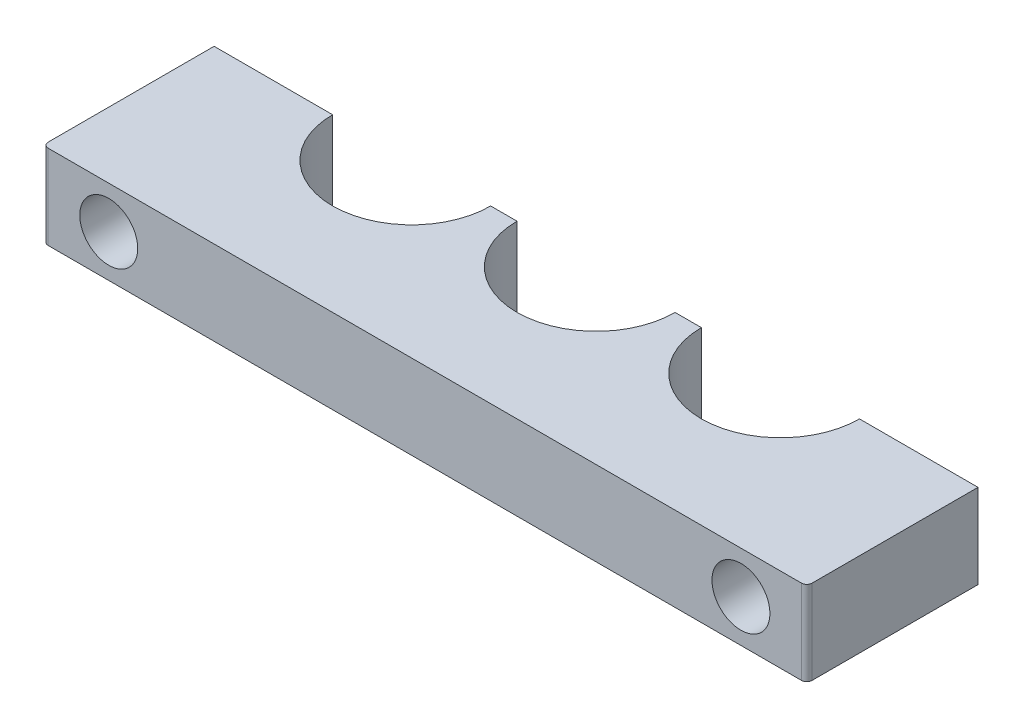
ISO-10303-21;
HEADER;
FILE_DESCRIPTION(('STEP AP214'),'2;1');
FILE_NAME('part.step','',(''),(''),'','','');
FILE_SCHEMA(('AUTOMOTIVE_DESIGN { 1 0 10303 214 1 1 1 1 }'));
ENDSEC;
DATA;
#1=APPLICATION_CONTEXT('core data for automotive mechanical design processes');
#2=APPLICATION_PROTOCOL_DEFINITION('international standard','automotive_design',2000,#1);
#3=PRODUCT_CONTEXT('',#1,'mechanical');
#4=PRODUCT('Part','Part','',(#3));
#5=PRODUCT_RELATED_PRODUCT_CATEGORY('part','',(#4));
#6=PRODUCT_DEFINITION_FORMATION('','',#4);
#7=PRODUCT_DEFINITION_CONTEXT('part definition',#1,'design');
#8=PRODUCT_DEFINITION('design','',#6,#7);
#9=PRODUCT_DEFINITION_SHAPE('','',#8);
#10=(LENGTH_UNIT() NAMED_UNIT(*) SI_UNIT(.MILLI.,.METRE.));
#11=(NAMED_UNIT(*) PLANE_ANGLE_UNIT() SI_UNIT($,.RADIAN.));
#12=(NAMED_UNIT(*) SI_UNIT($,.STERADIAN.) SOLID_ANGLE_UNIT());
#13=UNCERTAINTY_MEASURE_WITH_UNIT(LENGTH_MEASURE(1.E-05),#10,'distance_accuracy_value','');
#14=(GEOMETRIC_REPRESENTATION_CONTEXT(3) GLOBAL_UNCERTAINTY_ASSIGNED_CONTEXT((#13)) GLOBAL_UNIT_ASSIGNED_CONTEXT((#10,
#11,#12)) REPRESENTATION_CONTEXT('',''));
#15=CARTESIAN_POINT('',(0.,0.,0.));
#16=DIRECTION('',(0.,0.,1.));
#17=DIRECTION('',(1.,0.,0.));
#18=AXIS2_PLACEMENT_3D('',#15,#16,#17);
#19=CARTESIAN_POINT('',(71.5,16.,15.25));
#20=DIRECTION('',(0.,-1.,0.));
#21=DIRECTION('',(0.,0.,-1.));
#22=AXIS2_PLACEMENT_3D('',#19,#20,#21);
#23=CYLINDRICAL_SURFACE('',#22,1.);
#24=CARTESIAN_POINT('',(71.5,16.,15.25));
#25=DIRECTION('',(0.,1.,0.));
#26=DIRECTION('',(0.,0.,-1.));
#27=AXIS2_PLACEMENT_3D('',#24,#25,#26);
#28=CIRCLE('',#27,1.);
#29=CARTESIAN_POINT('',(71.5,16.,16.25));
#30=VERTEX_POINT('',#29);
#31=CARTESIAN_POINT('',(72.5,16.,15.25));
#32=VERTEX_POINT('',#31);
#33=EDGE_CURVE('E172',#30,#32,#28,.T.);
#34=ORIENTED_EDGE('',*,*,#33,.F.);
#35=DIRECTION('',(0.,1.,0.));
#36=VECTOR('',#35,1.);
#37=CARTESIAN_POINT('',(71.5,16.,16.25));
#38=LINE('',#37,#36);
#39=CARTESIAN_POINT('',(71.5,0.,16.25));
#40=VERTEX_POINT('',#39);
#41=EDGE_CURVE('E135',#40,#30,#38,.T.);
#42=ORIENTED_EDGE('',*,*,#41,.F.);
#43=CARTESIAN_POINT('',(71.5,0.,15.25));
#44=DIRECTION('',(0.,-1.,0.));
#45=DIRECTION('',(0.,0.,-1.));
#46=AXIS2_PLACEMENT_3D('',#43,#44,#45);
#47=CIRCLE('',#46,1.);
#48=CARTESIAN_POINT('',(72.5,0.,15.25));
#49=VERTEX_POINT('',#48);
#50=EDGE_CURVE('E25',#49,#40,#47,.T.);
#51=ORIENTED_EDGE('',*,*,#50,.F.);
#52=DIRECTION('',(0.,-1.,0.));
#53=VECTOR('',#52,1.);
#54=CARTESIAN_POINT('',(72.5,16.,15.25));
#55=LINE('',#54,#53);
#56=EDGE_CURVE('E132',#32,#49,#55,.T.);
#57=ORIENTED_EDGE('',*,*,#56,.F.);
#58=EDGE_LOOP('',(#34,#42,#51,#57));
#59=FACE_BOUND('',#58,.T.);
#60=ADVANCED_FACE('F15',(#59),#23,.T.);
#61=CARTESIAN_POINT('',(-71.5,16.,15.25));
#62=DIRECTION('',(0.,-1.,0.));
#63=DIRECTION('',(0.,0.,-1.));
#64=AXIS2_PLACEMENT_3D('',#61,#62,#63);
#65=CYLINDRICAL_SURFACE('',#64,1.);
#66=CARTESIAN_POINT('',(-71.5,16.,15.25));
#67=DIRECTION('',(0.,1.,0.));
#68=DIRECTION('',(0.,0.,-1.));
#69=AXIS2_PLACEMENT_3D('',#66,#67,#68);
#70=CIRCLE('',#69,1.);
#71=CARTESIAN_POINT('',(-72.5,16.,15.25));
#72=VERTEX_POINT('',#71);
#73=CARTESIAN_POINT('',(-71.5,16.,16.25));
#74=VERTEX_POINT('',#73);
#75=EDGE_CURVE('E140',#72,#74,#70,.T.);
#76=ORIENTED_EDGE('',*,*,#75,.F.);
#77=DIRECTION('',(0.,1.,0.));
#78=VECTOR('',#77,1.);
#79=CARTESIAN_POINT('',(-72.5,16.,15.25));
#80=LINE('',#79,#78);
#81=CARTESIAN_POINT('',(-72.5,0.,15.25));
#82=VERTEX_POINT('',#81);
#83=EDGE_CURVE('E257',#82,#72,#80,.T.);
#84=ORIENTED_EDGE('',*,*,#83,.F.);
#85=CARTESIAN_POINT('',(-71.5,0.,15.25));
#86=DIRECTION('',(0.,-1.,0.));
#87=DIRECTION('',(0.,0.,-1.));
#88=AXIS2_PLACEMENT_3D('',#85,#86,#87);
#89=CIRCLE('',#88,1.);
#90=CARTESIAN_POINT('',(-71.5,0.,16.25));
#91=VERTEX_POINT('',#90);
#92=EDGE_CURVE('E10',#91,#82,#89,.T.);
#93=ORIENTED_EDGE('',*,*,#92,.F.);
#94=DIRECTION('',(0.,-1.,0.));
#95=VECTOR('',#94,1.);
#96=CARTESIAN_POINT('',(-71.5,16.,16.25));
#97=LINE('',#96,#95);
#98=EDGE_CURVE('E160',#74,#91,#97,.T.);
#99=ORIENTED_EDGE('',*,*,#98,.F.);
#100=EDGE_LOOP('',(#76,#84,#93,#99));
#101=FACE_BOUND('',#100,.T.);
#102=ADVANCED_FACE('F17',(#101),#65,.T.);
#103=CARTESIAN_POINT('',(-60.,8.,-33.2314230340251));
#104=DIRECTION('',(0.,0.,1.));
#105=DIRECTION('',(1.,0.,0.));
#106=AXIS2_PLACEMENT_3D('',#103,#104,#105);
#107=CYLINDRICAL_SURFACE('',#106,5.5);
#108=CARTESIAN_POINT('',(-60.,8.,-16.25));
#109=DIRECTION('',(0.,0.,-1.));
#110=DIRECTION('',(1.,0.,0.));
#111=AXIS2_PLACEMENT_3D('',#108,#109,#110);
#112=CIRCLE('',#111,5.5);
#113=CARTESIAN_POINT('',(-54.5,8.,-16.25));
#114=VERTEX_POINT('',#113);
#115=EDGE_CURVE('E198',#114,#114,#112,.T.);
#116=ORIENTED_EDGE('',*,*,#115,.T.);
#117=EDGE_LOOP('',(#116));
#118=FACE_BOUND('',#117,.T.);
#119=CARTESIAN_POINT('',(-60.,8.,16.25));
#120=DIRECTION('',(0.,0.,-1.));
#121=DIRECTION('',(1.,0.,0.));
#122=AXIS2_PLACEMENT_3D('',#119,#120,#121);
#123=CIRCLE('',#122,5.5);
#124=CARTESIAN_POINT('',(-54.5,8.,16.25));
#125=VERTEX_POINT('',#124);
#126=EDGE_CURVE('E268',#125,#125,#123,.T.);
#127=ORIENTED_EDGE('',*,*,#126,.F.);
#128=EDGE_LOOP('',(#127));
#129=FACE_BOUND('',#128,.T.);
#130=ADVANCED_FACE('F360',(#118,#129),#107,.F.);
#131=CARTESIAN_POINT('',(60.,8.,-33.2314230340251));
#132=DIRECTION('',(0.,0.,1.));
#133=DIRECTION('',(1.,0.,0.));
#134=AXIS2_PLACEMENT_3D('',#131,#132,#133);
#135=CYLINDRICAL_SURFACE('',#134,5.5);
#136=CARTESIAN_POINT('',(60.,8.,-16.25));
#137=DIRECTION('',(0.,0.,-1.));
#138=DIRECTION('',(1.,0.,0.));
#139=AXIS2_PLACEMENT_3D('',#136,#137,#138);
#140=CIRCLE('',#139,5.5);
#141=CARTESIAN_POINT('',(65.5,8.,-16.25));
#142=VERTEX_POINT('',#141);
#143=EDGE_CURVE('E36',#142,#142,#140,.T.);
#144=ORIENTED_EDGE('',*,*,#143,.T.);
#145=EDGE_LOOP('',(#144));
#146=FACE_BOUND('',#145,.T.);
#147=CARTESIAN_POINT('',(60.,8.,16.25));
#148=DIRECTION('',(0.,0.,-1.));
#149=DIRECTION('',(1.,0.,0.));
#150=AXIS2_PLACEMENT_3D('',#147,#148,#149);
#151=CIRCLE('',#150,5.5);
#152=CARTESIAN_POINT('',(65.5,8.,16.25));
#153=VERTEX_POINT('',#152);
#154=EDGE_CURVE('E269',#153,#153,#151,.T.);
#155=ORIENTED_EDGE('',*,*,#154,.F.);
#156=EDGE_LOOP('',(#155));
#157=FACE_BOUND('',#156,.T.);
#158=ADVANCED_FACE('F364',(#146,#157),#135,.F.);
#159=CARTESIAN_POINT('',(35.,0.,-16.25));
#160=DIRECTION('',(0.,-1.,0.));
#161=DIRECTION('',(0.,0.,-1.));
#162=AXIS2_PLACEMENT_3D('',#159,#160,#161);
#163=PLANE('',#162);
#164=DIRECTION('',(0.,0.,-1.));
#165=VECTOR('',#164,1.);
#166=CARTESIAN_POINT('',(72.5,0.,16.25));
#167=LINE('',#166,#165);
#168=CARTESIAN_POINT('',(72.5,0.,-16.25));
#169=VERTEX_POINT('',#168);
#170=EDGE_CURVE('E142',#49,#169,#167,.T.);
#171=ORIENTED_EDGE('',*,*,#170,.F.);
#172=ORIENTED_EDGE('',*,*,#50,.T.);
#173=DIRECTION('',(1.,0.,0.));
#174=VECTOR('',#173,1.);
#175=CARTESIAN_POINT('',(35.,0.,16.25));
#176=LINE('',#175,#174);
#177=EDGE_CURVE('E272',#91,#40,#176,.T.);
#178=ORIENTED_EDGE('',*,*,#177,.F.);
#179=ORIENTED_EDGE('',*,*,#92,.T.);
#180=DIRECTION('',(0.,0.,1.));
#181=VECTOR('',#180,1.);
#182=CARTESIAN_POINT('',(-72.5,0.,-16.25));
#183=LINE('',#182,#181);
#184=CARTESIAN_POINT('',(-72.5,0.,-16.25));
#185=VERTEX_POINT('',#184);
#186=EDGE_CURVE('E253',#185,#82,#183,.T.);
#187=ORIENTED_EDGE('',*,*,#186,.F.);
#188=DIRECTION('',(-1.,0.,0.));
#189=VECTOR('',#188,1.);
#190=CARTESIAN_POINT('',(-50.,0.,-16.25));
#191=LINE('',#190,#189);
#192=CARTESIAN_POINT('',(-50.,0.,-16.25));
#193=VERTEX_POINT('',#192);
#194=EDGE_CURVE('E193',#193,#185,#191,.T.);
#195=ORIENTED_EDGE('',*,*,#194,.F.);
#196=CARTESIAN_POINT('',(-35.,0.,-16.25));
#197=DIRECTION('',(0.,-1.,0.));
#198=DIRECTION('',(1.,0.,0.));
#199=AXIS2_PLACEMENT_3D('',#196,#197,#198);
#200=CIRCLE('',#199,15.);
#201=CARTESIAN_POINT('',(-20.,0.,-16.25));
#202=VERTEX_POINT('',#201);
#203=EDGE_CURVE('E215',#202,#193,#200,.T.);
#204=ORIENTED_EDGE('',*,*,#203,.F.);
#205=DIRECTION('',(-1.,0.,0.));
#206=VECTOR('',#205,1.);
#207=CARTESIAN_POINT('',(-15.,0.,-16.25));
#208=LINE('',#207,#206);
#209=CARTESIAN_POINT('',(-15.,0.,-16.25));
#210=VERTEX_POINT('',#209);
#211=EDGE_CURVE('E224',#210,#202,#208,.T.);
#212=ORIENTED_EDGE('',*,*,#211,.F.);
#213=CARTESIAN_POINT('',(0.,0.,-16.25));
#214=DIRECTION('',(0.,-1.,0.));
#215=DIRECTION('',(1.,0.,0.));
#216=AXIS2_PLACEMENT_3D('',#213,#214,#215);
#217=CIRCLE('',#216,15.);
#218=CARTESIAN_POINT('',(15.,0.,-16.25));
#219=VERTEX_POINT('',#218);
#220=EDGE_CURVE('E220',#219,#210,#217,.T.);
#221=ORIENTED_EDGE('',*,*,#220,.F.);
#222=DIRECTION('',(-1.,0.,0.));
#223=VECTOR('',#222,1.);
#224=CARTESIAN_POINT('',(20.,0.,-16.25));
#225=LINE('',#224,#223);
#226=CARTESIAN_POINT('',(20.,0.,-16.25));
#227=VERTEX_POINT('',#226);
#228=EDGE_CURVE('E202',#227,#219,#225,.T.);
#229=ORIENTED_EDGE('',*,*,#228,.F.);
#230=CARTESIAN_POINT('',(35.,0.,-16.25));
#231=DIRECTION('',(0.,-1.,0.));
#232=DIRECTION('',(1.,0.,0.));
#233=AXIS2_PLACEMENT_3D('',#230,#231,#232);
#234=CIRCLE('',#233,15.);
#235=CARTESIAN_POINT('',(50.,0.,-16.25));
#236=VERTEX_POINT('',#235);
#237=EDGE_CURVE('E328',#236,#227,#234,.T.);
#238=ORIENTED_EDGE('',*,*,#237,.F.);
#239=DIRECTION('',(-1.,0.,0.));
#240=VECTOR('',#239,1.);
#241=CARTESIAN_POINT('',(72.5,0.,-16.25));
#242=LINE('',#241,#240);
#243=EDGE_CURVE('E146',#169,#236,#242,.T.);
#244=ORIENTED_EDGE('',*,*,#243,.F.);
#245=EDGE_LOOP('',(#171,#172,#178,#179,#187,#195,#204,#212,#221,#229,#238,#244));
#246=FACE_BOUND('',#245,.T.);
#247=ADVANCED_FACE('F143',(#246),#163,.T.);
#248=CARTESIAN_POINT('',(35.,16.,-16.25));
#249=DIRECTION('',(0.,-1.,0.));
#250=DIRECTION('',(0.,0.,-1.));
#251=AXIS2_PLACEMENT_3D('',#248,#249,#250);
#252=PLANE('',#251);
#253=DIRECTION('',(1.,0.,0.));
#254=VECTOR('',#253,1.);
#255=CARTESIAN_POINT('',(-72.5,16.,16.25));
#256=LINE('',#255,#254);
#257=EDGE_CURVE('E261',#74,#30,#256,.T.);
#258=ORIENTED_EDGE('',*,*,#257,.T.);
#259=ORIENTED_EDGE('',*,*,#33,.T.);
#260=DIRECTION('',(0.,0.,-1.));
#261=VECTOR('',#260,1.);
#262=CARTESIAN_POINT('',(72.5,16.,16.25));
#263=LINE('',#262,#261);
#264=CARTESIAN_POINT('',(72.5,16.,-16.25));
#265=VERTEX_POINT('',#264);
#266=EDGE_CURVE('E153',#32,#265,#263,.T.);
#267=ORIENTED_EDGE('',*,*,#266,.T.);
#268=DIRECTION('',(-1.,0.,0.));
#269=VECTOR('',#268,1.);
#270=CARTESIAN_POINT('',(72.5,16.,-16.25));
#271=LINE('',#270,#269);
#272=CARTESIAN_POINT('',(50.,16.,-16.25));
#273=VERTEX_POINT('',#272);
#274=EDGE_CURVE('E122',#265,#273,#271,.T.);
#275=ORIENTED_EDGE('',*,*,#274,.T.);
#276=CARTESIAN_POINT('',(35.,16.,-16.25));
#277=DIRECTION('',(0.,-1.,0.));
#278=DIRECTION('',(1.,0.,0.));
#279=AXIS2_PLACEMENT_3D('',#276,#277,#278);
#280=CIRCLE('',#279,15.);
#281=CARTESIAN_POINT('',(20.,16.,-16.25));
#282=VERTEX_POINT('',#281);
#283=EDGE_CURVE('E188',#273,#282,#280,.T.);
#284=ORIENTED_EDGE('',*,*,#283,.T.);
#285=DIRECTION('',(-1.,0.,0.));
#286=VECTOR('',#285,1.);
#287=CARTESIAN_POINT('',(20.,16.,-16.25));
#288=LINE('',#287,#286);
#289=CARTESIAN_POINT('',(15.,16.,-16.25));
#290=VERTEX_POINT('',#289);
#291=EDGE_CURVE('E210',#282,#290,#288,.T.);
#292=ORIENTED_EDGE('',*,*,#291,.T.);
#293=CARTESIAN_POINT('',(0.,16.,-16.25));
#294=DIRECTION('',(0.,-1.,0.));
#295=DIRECTION('',(1.,0.,0.));
#296=AXIS2_PLACEMENT_3D('',#293,#294,#295);
#297=CIRCLE('',#296,15.);
#298=CARTESIAN_POINT('',(-15.,16.,-16.25));
#299=VERTEX_POINT('',#298);
#300=EDGE_CURVE('E229',#290,#299,#297,.T.);
#301=ORIENTED_EDGE('',*,*,#300,.T.);
#302=DIRECTION('',(-1.,0.,0.));
#303=VECTOR('',#302,1.);
#304=CARTESIAN_POINT('',(-15.,16.,-16.25));
#305=LINE('',#304,#303);
#306=CARTESIAN_POINT('',(-20.,16.,-16.25));
#307=VERTEX_POINT('',#306);
#308=EDGE_CURVE('E211',#299,#307,#305,.T.);
#309=ORIENTED_EDGE('',*,*,#308,.T.);
#310=CARTESIAN_POINT('',(-35.,16.,-16.25));
#311=DIRECTION('',(0.,-1.,0.));
#312=DIRECTION('',(1.,0.,0.));
#313=AXIS2_PLACEMENT_3D('',#310,#311,#312);
#314=CIRCLE('',#313,15.);
#315=CARTESIAN_POINT('',(-50.,16.,-16.25));
#316=VERTEX_POINT('',#315);
#317=EDGE_CURVE('E233',#307,#316,#314,.T.);
#318=ORIENTED_EDGE('',*,*,#317,.T.);
#319=DIRECTION('',(-1.,0.,0.));
#320=VECTOR('',#319,1.);
#321=CARTESIAN_POINT('',(-50.,16.,-16.25));
#322=LINE('',#321,#320);
#323=CARTESIAN_POINT('',(-72.5,16.,-16.25));
#324=VERTEX_POINT('',#323);
#325=EDGE_CURVE('E249',#316,#324,#322,.T.);
#326=ORIENTED_EDGE('',*,*,#325,.T.);
#327=DIRECTION('',(0.,0.,1.));
#328=VECTOR('',#327,1.);
#329=CARTESIAN_POINT('',(-72.5,16.,-16.25));
#330=LINE('',#329,#328);
#331=EDGE_CURVE('E265',#324,#72,#330,.T.);
#332=ORIENTED_EDGE('',*,*,#331,.T.);
#333=ORIENTED_EDGE('',*,*,#75,.T.);
#334=EDGE_LOOP('',(#258,#259,#267,#275,#284,#292,#301,#309,#318,#326,#332,#333));
#335=FACE_BOUND('',#334,.T.);
#336=ADVANCED_FACE('F280',(#335),#252,.F.);
#337=CARTESIAN_POINT('',(72.5,16.,-16.25));
#338=DIRECTION('',(0.,0.,1.));
#339=DIRECTION('',(1.,0.,0.));
#340=AXIS2_PLACEMENT_3D('',#337,#338,#339);
#341=PLANE('',#340);
#342=ORIENTED_EDGE('',*,*,#243,.T.);
#343=DIRECTION('',(0.,-1.,0.));
#344=VECTOR('',#343,1.);
#345=CARTESIAN_POINT('',(50.,16.,-16.25));
#346=LINE('',#345,#344);
#347=EDGE_CURVE('E192',#273,#236,#346,.T.);
#348=ORIENTED_EDGE('',*,*,#347,.F.);
#349=ORIENTED_EDGE('',*,*,#274,.F.);
#350=DIRECTION('',(0.,-1.,0.));
#351=VECTOR('',#350,1.);
#352=CARTESIAN_POINT('',(72.5,16.,-16.25));
#353=LINE('',#352,#351);
#354=EDGE_CURVE('E149',#265,#169,#353,.T.);
#355=ORIENTED_EDGE('',*,*,#354,.T.);
#356=EDGE_LOOP('',(#342,#348,#349,#355));
#357=FACE_BOUND('',#356,.T.);
#358=ORIENTED_EDGE('',*,*,#143,.F.);
#359=EDGE_LOOP('',(#358));
#360=FACE_BOUND('',#359,.T.);
#361=ADVANCED_FACE('F343',(#357,#360),#341,.F.);
#362=CARTESIAN_POINT('',(72.5,16.,16.25));
#363=DIRECTION('',(-1.,0.,0.));
#364=DIRECTION('',(0.,0.,1.));
#365=AXIS2_PLACEMENT_3D('',#362,#363,#364);
#366=PLANE('',#365);
#367=ORIENTED_EDGE('',*,*,#266,.F.);
#368=ORIENTED_EDGE('',*,*,#56,.T.);
#369=ORIENTED_EDGE('',*,*,#170,.T.);
#370=ORIENTED_EDGE('',*,*,#354,.F.);
#371=EDGE_LOOP('',(#367,#368,#369,#370));
#372=FACE_BOUND('',#371,.T.);
#373=ADVANCED_FACE('F151',(#372),#366,.F.);
#374=CARTESIAN_POINT('',(35.,16.,16.25));
#375=DIRECTION('',(0.,0.,-1.));
#376=DIRECTION('',(0.,-1.,0.));
#377=AXIS2_PLACEMENT_3D('',#374,#375,#376);
#378=PLANE('',#377);
#379=ORIENTED_EDGE('',*,*,#177,.T.);
#380=ORIENTED_EDGE('',*,*,#41,.T.);
#381=ORIENTED_EDGE('',*,*,#257,.F.);
#382=ORIENTED_EDGE('',*,*,#98,.T.);
#383=EDGE_LOOP('',(#379,#380,#381,#382));
#384=FACE_BOUND('',#383,.T.);
#385=ORIENTED_EDGE('',*,*,#154,.T.);
#386=EDGE_LOOP('',(#385));
#387=FACE_BOUND('',#386,.T.);
#388=ORIENTED_EDGE('',*,*,#126,.T.);
#389=EDGE_LOOP('',(#388));
#390=FACE_BOUND('',#389,.T.);
#391=ADVANCED_FACE('F282',(#384,#387,#390),#378,.F.);
#392=CARTESIAN_POINT('',(-72.5,16.,-16.25));
#393=DIRECTION('',(1.,0.,0.));
#394=DIRECTION('',(0.,1.,0.));
#395=AXIS2_PLACEMENT_3D('',#392,#393,#394);
#396=PLANE('',#395);
#397=ORIENTED_EDGE('',*,*,#186,.T.);
#398=ORIENTED_EDGE('',*,*,#83,.T.);
#399=ORIENTED_EDGE('',*,*,#331,.F.);
#400=DIRECTION('',(0.,-1.,0.));
#401=VECTOR('',#400,1.);
#402=CARTESIAN_POINT('',(-72.5,16.,-16.25));
#403=LINE('',#402,#401);
#404=EDGE_CURVE('E197',#324,#185,#403,.T.);
#405=ORIENTED_EDGE('',*,*,#404,.T.);
#406=EDGE_LOOP('',(#397,#398,#399,#405));
#407=FACE_BOUND('',#406,.T.);
#408=ADVANCED_FACE('F289',(#407),#396,.F.);
#409=CARTESIAN_POINT('',(-50.,16.,-16.25));
#410=DIRECTION('',(0.,0.,1.));
#411=DIRECTION('',(1.,0.,0.));
#412=AXIS2_PLACEMENT_3D('',#409,#410,#411);
#413=PLANE('',#412);
#414=ORIENTED_EDGE('',*,*,#194,.T.);
#415=ORIENTED_EDGE('',*,*,#404,.F.);
#416=ORIENTED_EDGE('',*,*,#325,.F.);
#417=DIRECTION('',(0.,-1.,0.));
#418=VECTOR('',#417,1.);
#419=CARTESIAN_POINT('',(-50.,16.,-16.25));
#420=LINE('',#419,#418);
#421=EDGE_CURVE('E237',#316,#193,#420,.T.);
#422=ORIENTED_EDGE('',*,*,#421,.T.);
#423=EDGE_LOOP('',(#414,#415,#416,#422));
#424=FACE_BOUND('',#423,.T.);
#425=ORIENTED_EDGE('',*,*,#115,.F.);
#426=EDGE_LOOP('',(#425));
#427=FACE_BOUND('',#426,.T.);
#428=ADVANCED_FACE('F294',(#424,#427),#413,.F.);
#429=CARTESIAN_POINT('',(-35.,16.,-16.25));
#430=DIRECTION('',(0.,-1.,0.));
#431=DIRECTION('',(0.,0.,-1.));
#432=AXIS2_PLACEMENT_3D('',#429,#430,#431);
#433=CYLINDRICAL_SURFACE('',#432,15.);
#434=ORIENTED_EDGE('',*,*,#203,.T.);
#435=ORIENTED_EDGE('',*,*,#421,.F.);
#436=ORIENTED_EDGE('',*,*,#317,.F.);
#437=DIRECTION('',(0.,-1.,0.));
#438=VECTOR('',#437,1.);
#439=CARTESIAN_POINT('',(-20.,16.,-16.25));
#440=LINE('',#439,#438);
#441=EDGE_CURVE('E216',#307,#202,#440,.T.);
#442=ORIENTED_EDGE('',*,*,#441,.T.);
#443=EDGE_LOOP('',(#434,#435,#436,#442));
#444=FACE_BOUND('',#443,.T.);
#445=ADVANCED_FACE('F375',(#444),#433,.F.);
#446=CARTESIAN_POINT('',(-15.,16.,-16.25));
#447=DIRECTION('',(0.,0.,1.));
#448=DIRECTION('',(1.,0.,0.));
#449=AXIS2_PLACEMENT_3D('',#446,#447,#448);
#450=PLANE('',#449);
#451=ORIENTED_EDGE('',*,*,#211,.T.);
#452=ORIENTED_EDGE('',*,*,#441,.F.);
#453=ORIENTED_EDGE('',*,*,#308,.F.);
#454=DIRECTION('',(0.,-1.,0.));
#455=VECTOR('',#454,1.);
#456=CARTESIAN_POINT('',(-15.,16.,-16.25));
#457=LINE('',#456,#455);
#458=EDGE_CURVE('E228',#299,#210,#457,.T.);
#459=ORIENTED_EDGE('',*,*,#458,.T.);
#460=EDGE_LOOP('',(#451,#452,#453,#459));
#461=FACE_BOUND('',#460,.T.);
#462=ADVANCED_FACE('F341',(#461),#450,.F.);
#463=CARTESIAN_POINT('',(0.,16.,-16.25));
#464=DIRECTION('',(0.,-1.,0.));
#465=DIRECTION('',(0.,0.,-1.));
#466=AXIS2_PLACEMENT_3D('',#463,#464,#465);
#467=CYLINDRICAL_SURFACE('',#466,15.);
#468=ORIENTED_EDGE('',*,*,#220,.T.);
#469=ORIENTED_EDGE('',*,*,#458,.F.);
#470=ORIENTED_EDGE('',*,*,#300,.F.);
#471=DIRECTION('',(0.,-1.,0.));
#472=VECTOR('',#471,1.);
#473=CARTESIAN_POINT('',(15.,16.,-16.25));
#474=LINE('',#473,#472);
#475=EDGE_CURVE('E206',#290,#219,#474,.T.);
#476=ORIENTED_EDGE('',*,*,#475,.T.);
#477=EDGE_LOOP('',(#468,#469,#470,#476));
#478=FACE_BOUND('',#477,.T.);
#479=ADVANCED_FACE('F320',(#478),#467,.F.);
#480=CARTESIAN_POINT('',(20.,16.,-16.25));
#481=DIRECTION('',(0.,0.,1.));
#482=DIRECTION('',(1.,0.,0.));
#483=AXIS2_PLACEMENT_3D('',#480,#481,#482);
#484=PLANE('',#483);
#485=ORIENTED_EDGE('',*,*,#228,.T.);
#486=ORIENTED_EDGE('',*,*,#475,.F.);
#487=ORIENTED_EDGE('',*,*,#291,.F.);
#488=DIRECTION('',(0.,-1.,0.));
#489=VECTOR('',#488,1.);
#490=CARTESIAN_POINT('',(20.,16.,-16.25));
#491=LINE('',#490,#489);
#492=EDGE_CURVE('E186',#282,#227,#491,.T.);
#493=ORIENTED_EDGE('',*,*,#492,.T.);
#494=EDGE_LOOP('',(#485,#486,#487,#493));
#495=FACE_BOUND('',#494,.T.);
#496=ADVANCED_FACE('F322',(#495),#484,.F.);
#497=CARTESIAN_POINT('',(35.,16.,-16.25));
#498=DIRECTION('',(0.,-1.,0.));
#499=DIRECTION('',(0.,0.,-1.));
#500=AXIS2_PLACEMENT_3D('',#497,#498,#499);
#501=CYLINDRICAL_SURFACE('',#500,15.);
#502=ORIENTED_EDGE('',*,*,#237,.T.);
#503=ORIENTED_EDGE('',*,*,#492,.F.);
#504=ORIENTED_EDGE('',*,*,#283,.F.);
#505=ORIENTED_EDGE('',*,*,#347,.T.);
#506=EDGE_LOOP('',(#502,#503,#504,#505));
#507=FACE_BOUND('',#506,.T.);
#508=ADVANCED_FACE('F329',(#507),#501,.F.);
#509=CLOSED_SHELL('',(#60,#102,#130,#158,#247,#336,#361,#373,#391,#408,#428,#445,#462,#479,#496,#508));
#510=MANIFOLD_SOLID_BREP('B1',#509);
#511=ADVANCED_BREP_SHAPE_REPRESENTATION('',(#18,#510),#14);
#512=SHAPE_DEFINITION_REPRESENTATION(#9,#511);
ENDSEC;
END-ISO-10303-21;
